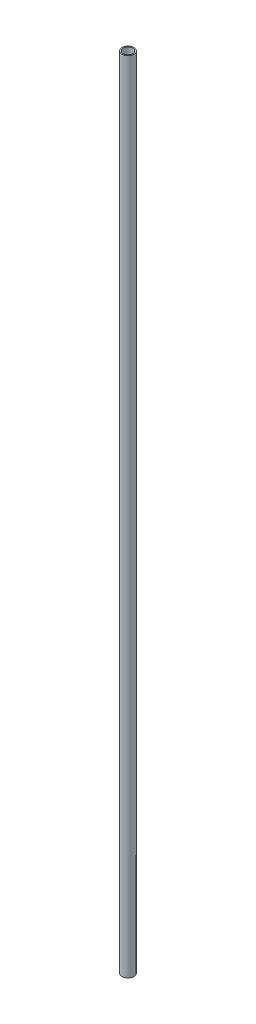
ISO-10303-21;
HEADER;
FILE_DESCRIPTION(('STEP AP214'),'2;1');
FILE_NAME('part.step','',(''),(''),'','','');
FILE_SCHEMA(('AUTOMOTIVE_DESIGN { 1 0 10303 214 1 1 1 1 }'));
ENDSEC;
DATA;
#1=APPLICATION_CONTEXT('core data for automotive mechanical design processes');
#2=APPLICATION_PROTOCOL_DEFINITION('international standard','automotive_design',2000,#1);
#3=PRODUCT_CONTEXT('',#1,'mechanical');
#4=PRODUCT('Part','Part','',(#3));
#5=PRODUCT_RELATED_PRODUCT_CATEGORY('part','',(#4));
#6=PRODUCT_DEFINITION_FORMATION('','',#4);
#7=PRODUCT_DEFINITION_CONTEXT('part definition',#1,'design');
#8=PRODUCT_DEFINITION('design','',#6,#7);
#9=PRODUCT_DEFINITION_SHAPE('','',#8);
#10=(LENGTH_UNIT() NAMED_UNIT(*) SI_UNIT(.MILLI.,.METRE.));
#11=(NAMED_UNIT(*) PLANE_ANGLE_UNIT() SI_UNIT($,.RADIAN.));
#12=(NAMED_UNIT(*) SI_UNIT($,.STERADIAN.) SOLID_ANGLE_UNIT());
#13=UNCERTAINTY_MEASURE_WITH_UNIT(LENGTH_MEASURE(1.E-05),#10,'distance_accuracy_value','');
#14=(GEOMETRIC_REPRESENTATION_CONTEXT(3) GLOBAL_UNCERTAINTY_ASSIGNED_CONTEXT((#13)) GLOBAL_UNIT_ASSIGNED_CONTEXT((#10,
#11,#12)) REPRESENTATION_CONTEXT('',''));
#15=CARTESIAN_POINT('',(0.,0.,0.));
#16=DIRECTION('',(0.,0.,1.));
#17=DIRECTION('',(1.,0.,0.));
#18=AXIS2_PLACEMENT_3D('',#15,#16,#17);
#19=CARTESIAN_POINT('',(0.,1005.,0.));
#20=DIRECTION('',(0.,1.,0.));
#21=DIRECTION('',(0.,0.,1.));
#22=AXIS2_PLACEMENT_3D('',#19,#20,#21);
#23=PLANE('',#22);
#24=CARTESIAN_POINT('',(0.,1005.,0.));
#25=DIRECTION('',(0.,1.,0.));
#26=DIRECTION('',(0.,0.,1.));
#27=AXIS2_PLACEMENT_3D('',#24,#25,#26);
#28=CIRCLE('',#27,7.5);
#29=CARTESIAN_POINT('',(0.,1005.,7.5));
#30=VERTEX_POINT('',#29);
#31=EDGE_CURVE('E10',#30,#30,#28,.T.);
#32=ORIENTED_EDGE('',*,*,#31,.T.);
#33=EDGE_LOOP('',(#32));
#34=FACE_BOUND('',#33,.T.);
#35=CARTESIAN_POINT('',(0.,1005.,0.));
#36=DIRECTION('',(0.,1.,0.));
#37=DIRECTION('',(0.,0.,1.));
#38=AXIS2_PLACEMENT_3D('',#35,#36,#37);
#39=CIRCLE('',#38,6.);
#40=CARTESIAN_POINT('',(0.,1005.,6.));
#41=VERTEX_POINT('',#40);
#42=EDGE_CURVE('E56',#41,#41,#39,.T.);
#43=ORIENTED_EDGE('',*,*,#42,.F.);
#44=EDGE_LOOP('',(#43));
#45=FACE_BOUND('',#44,.T.);
#46=ADVANCED_FACE('F43',(#34,#45),#23,.T.);
#47=CARTESIAN_POINT('',(0.,0.,0.));
#48=DIRECTION('',(0.,1.,0.));
#49=DIRECTION('',(0.,0.,1.));
#50=AXIS2_PLACEMENT_3D('',#47,#48,#49);
#51=PLANE('',#50);
#52=CARTESIAN_POINT('',(0.,0.,0.));
#53=DIRECTION('',(0.,1.,0.));
#54=DIRECTION('',(0.,0.,1.));
#55=AXIS2_PLACEMENT_3D('',#52,#53,#54);
#56=CIRCLE('',#55,7.5);
#57=CARTESIAN_POINT('',(0.,0.,7.5));
#58=VERTEX_POINT('',#57);
#59=EDGE_CURVE('E47',#58,#58,#56,.T.);
#60=ORIENTED_EDGE('',*,*,#59,.F.);
#61=EDGE_LOOP('',(#60));
#62=FACE_BOUND('',#61,.T.);
#63=CARTESIAN_POINT('',(0.,0.,0.));
#64=DIRECTION('',(0.,1.,0.));
#65=DIRECTION('',(0.,0.,1.));
#66=AXIS2_PLACEMENT_3D('',#63,#64,#65);
#67=CIRCLE('',#66,6.);
#68=CARTESIAN_POINT('',(0.,0.,6.));
#69=VERTEX_POINT('',#68);
#70=EDGE_CURVE('E58',#69,#69,#67,.T.);
#71=ORIENTED_EDGE('',*,*,#70,.T.);
#72=EDGE_LOOP('',(#71));
#73=FACE_BOUND('',#72,.T.);
#74=ADVANCED_FACE('F70',(#62,#73),#51,.F.);
#75=CARTESIAN_POINT('',(0.,1005.,0.));
#76=DIRECTION('',(0.,-1.,0.));
#77=DIRECTION('',(0.,0.,-1.));
#78=AXIS2_PLACEMENT_3D('',#75,#76,#77);
#79=CYLINDRICAL_SURFACE('',#78,7.5);
#80=ORIENTED_EDGE('',*,*,#31,.F.);
#81=EDGE_LOOP('',(#80));
#82=FACE_BOUND('',#81,.T.);
#83=ORIENTED_EDGE('',*,*,#59,.T.);
#84=EDGE_LOOP('',(#83));
#85=FACE_BOUND('',#84,.T.);
#86=ADVANCED_FACE('F45',(#82,#85),#79,.T.);
#87=CARTESIAN_POINT('',(0.,1005.,0.));
#88=DIRECTION('',(0.,-1.,0.));
#89=DIRECTION('',(0.,0.,-1.));
#90=AXIS2_PLACEMENT_3D('',#87,#88,#89);
#91=CYLINDRICAL_SURFACE('',#90,6.);
#92=ORIENTED_EDGE('',*,*,#42,.T.);
#93=EDGE_LOOP('',(#92));
#94=FACE_BOUND('',#93,.T.);
#95=ORIENTED_EDGE('',*,*,#70,.F.);
#96=EDGE_LOOP('',(#95));
#97=FACE_BOUND('',#96,.T.);
#98=ADVANCED_FACE('F66',(#94,#97),#91,.F.);
#99=CLOSED_SHELL('',(#46,#74,#86,#98));
#100=MANIFOLD_SOLID_BREP('B2',#99);
#101=ADVANCED_BREP_SHAPE_REPRESENTATION('',(#18,#100),#14);
#102=SHAPE_DEFINITION_REPRESENTATION(#9,#101);
ENDSEC;
END-ISO-10303-21;
